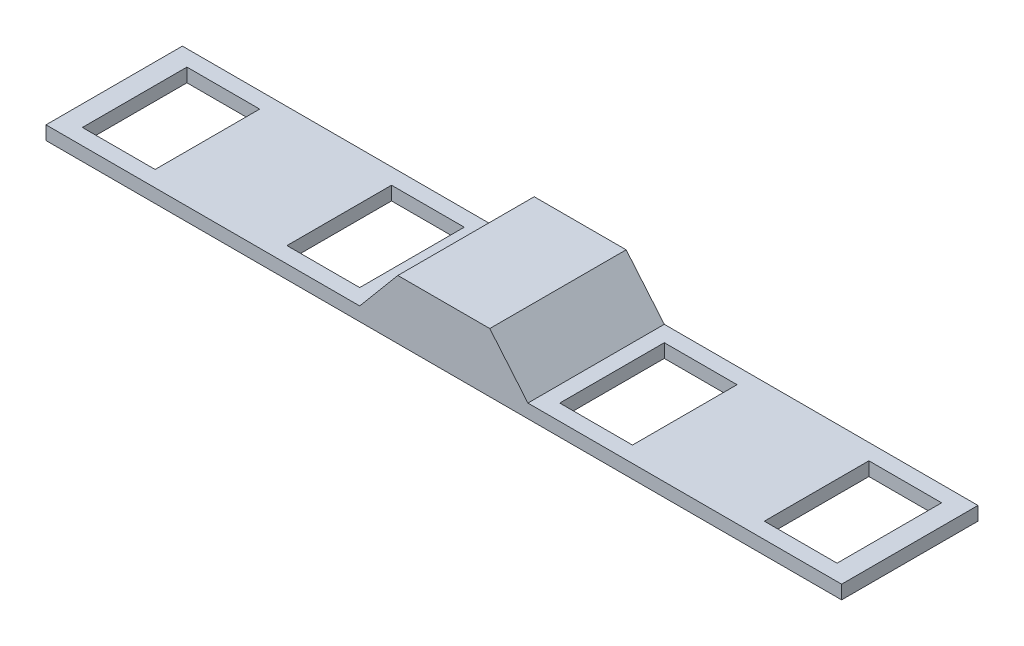
ISO-10303-21;
HEADER;
FILE_DESCRIPTION(('STEP AP214'),'2;1');
FILE_NAME('part.step','',(''),(''),'','','');
FILE_SCHEMA(('AUTOMOTIVE_DESIGN { 1 0 10303 214 1 1 1 1 }'));
ENDSEC;
DATA;
#1=APPLICATION_CONTEXT('core data for automotive mechanical design processes');
#2=APPLICATION_PROTOCOL_DEFINITION('international standard','automotive_design',2000,#1);
#3=PRODUCT_CONTEXT('',#1,'mechanical');
#4=PRODUCT('Part','Part','',(#3));
#5=PRODUCT_RELATED_PRODUCT_CATEGORY('part','',(#4));
#6=PRODUCT_DEFINITION_FORMATION('','',#4);
#7=PRODUCT_DEFINITION_CONTEXT('part definition',#1,'design');
#8=PRODUCT_DEFINITION('design','',#6,#7);
#9=PRODUCT_DEFINITION_SHAPE('','',#8);
#10=(LENGTH_UNIT() NAMED_UNIT(*) SI_UNIT(.MILLI.,.METRE.));
#11=(NAMED_UNIT(*) PLANE_ANGLE_UNIT() SI_UNIT($,.RADIAN.));
#12=(NAMED_UNIT(*) SI_UNIT($,.STERADIAN.) SOLID_ANGLE_UNIT());
#13=UNCERTAINTY_MEASURE_WITH_UNIT(LENGTH_MEASURE(1.E-05),#10,'distance_accuracy_value','');
#14=(GEOMETRIC_REPRESENTATION_CONTEXT(3) GLOBAL_UNCERTAINTY_ASSIGNED_CONTEXT((#13)) GLOBAL_UNIT_ASSIGNED_CONTEXT((#10,
#11,#12)) REPRESENTATION_CONTEXT('',''));
#15=CARTESIAN_POINT('',(0.,0.,0.));
#16=DIRECTION('',(0.,0.,1.));
#17=DIRECTION('',(1.,0.,0.));
#18=AXIS2_PLACEMENT_3D('',#15,#16,#17);
#19=CARTESIAN_POINT('',(0.,3.,0.));
#20=DIRECTION('',(0.,-1.,0.));
#21=DIRECTION('',(0.,0.,-1.));
#22=AXIS2_PLACEMENT_3D('',#19,#20,#21);
#23=PLANE('',#22);
#24=DIRECTION('',(1.,0.,0.));
#25=VECTOR('',#24,1.);
#26=CARTESIAN_POINT('',(83.,3.,11.5));
#27=LINE('',#26,#25);
#28=CARTESIAN_POINT('',(67.,3.,11.5));
#29=VERTEX_POINT('',#28);
#30=CARTESIAN_POINT('',(83.,3.,11.5));
#31=VERTEX_POINT('',#30);
#32=EDGE_CURVE('E228',#29,#31,#27,.T.);
#33=ORIENTED_EDGE('',*,*,#32,.F.);
#34=DIRECTION('',(0.,0.,1.));
#35=VECTOR('',#34,1.);
#36=CARTESIAN_POINT('',(67.,3.,11.5));
#37=LINE('',#36,#35);
#38=CARTESIAN_POINT('',(67.,3.,-11.5));
#39=VERTEX_POINT('',#38);
#40=EDGE_CURVE('E236',#39,#29,#37,.T.);
#41=ORIENTED_EDGE('',*,*,#40,.F.);
#42=DIRECTION('',(-1.,0.,0.));
#43=VECTOR('',#42,1.);
#44=CARTESIAN_POINT('',(83.,3.,-11.5));
#45=LINE('',#44,#43);
#46=CARTESIAN_POINT('',(83.,3.,-11.5));
#47=VERTEX_POINT('',#46);
#48=EDGE_CURVE('E233',#47,#39,#45,.T.);
#49=ORIENTED_EDGE('',*,*,#48,.F.);
#50=DIRECTION('',(0.,0.,-1.));
#51=VECTOR('',#50,1.);
#52=CARTESIAN_POINT('',(83.,3.,11.5));
#53=LINE('',#52,#51);
#54=EDGE_CURVE('E230',#31,#47,#53,.T.);
#55=ORIENTED_EDGE('',*,*,#54,.F.);
#56=EDGE_LOOP('',(#33,#41,#49,#55));
#57=FACE_BOUND('',#56,.T.);
#58=DIRECTION('',(1.,0.,0.));
#59=VECTOR('',#58,1.);
#60=CARTESIAN_POINT('',(38.,3.,11.5));
#61=LINE('',#60,#59);
#62=CARTESIAN_POINT('',(22.,3.,11.5));
#63=VERTEX_POINT('',#62);
#64=CARTESIAN_POINT('',(38.,3.,11.5));
#65=VERTEX_POINT('',#64);
#66=EDGE_CURVE('E260',#63,#65,#61,.T.);
#67=ORIENTED_EDGE('',*,*,#66,.F.);
#68=DIRECTION('',(0.,0.,1.));
#69=VECTOR('',#68,1.);
#70=CARTESIAN_POINT('',(22.,3.,11.5));
#71=LINE('',#70,#69);
#72=CARTESIAN_POINT('',(22.,3.,-11.5));
#73=VERTEX_POINT('',#72);
#74=EDGE_CURVE('E268',#73,#63,#71,.T.);
#75=ORIENTED_EDGE('',*,*,#74,.F.);
#76=DIRECTION('',(-1.,0.,0.));
#77=VECTOR('',#76,1.);
#78=CARTESIAN_POINT('',(38.,3.,-11.5));
#79=LINE('',#78,#77);
#80=CARTESIAN_POINT('',(38.,3.,-11.5));
#81=VERTEX_POINT('',#80);
#82=EDGE_CURVE('E265',#81,#73,#79,.T.);
#83=ORIENTED_EDGE('',*,*,#82,.F.);
#84=DIRECTION('',(0.,0.,-1.));
#85=VECTOR('',#84,1.);
#86=CARTESIAN_POINT('',(38.,3.,11.5));
#87=LINE('',#86,#85);
#88=EDGE_CURVE('E262',#65,#81,#87,.T.);
#89=ORIENTED_EDGE('',*,*,#88,.F.);
#90=EDGE_LOOP('',(#67,#75,#83,#89));
#91=FACE_BOUND('',#90,.T.);
#92=DIRECTION('',(0.,0.,-1.));
#93=VECTOR('',#92,1.);
#94=CARTESIAN_POINT('',(18.5,3.,15.));
#95=LINE('',#94,#93);
#96=CARTESIAN_POINT('',(18.5,3.,15.));
#97=VERTEX_POINT('',#96);
#98=CARTESIAN_POINT('',(18.5,3.,-15.));
#99=VERTEX_POINT('',#98);
#100=EDGE_CURVE('E220',#97,#99,#95,.T.);
#101=ORIENTED_EDGE('',*,*,#100,.F.);
#102=DIRECTION('',(1.,0.,0.));
#103=VECTOR('',#102,1.);
#104=CARTESIAN_POINT('',(-87.5,3.,15.));
#105=LINE('',#104,#103);
#106=CARTESIAN_POINT('',(87.5,3.,15.));
#107=VERTEX_POINT('',#106);
#108=EDGE_CURVE('E215',#97,#107,#105,.T.);
#109=ORIENTED_EDGE('',*,*,#108,.T.);
#110=DIRECTION('',(0.,0.,-1.));
#111=VECTOR('',#110,1.);
#112=CARTESIAN_POINT('',(87.5,3.,15.));
#113=LINE('',#112,#111);
#114=CARTESIAN_POINT('',(87.5,3.,-15.));
#115=VERTEX_POINT('',#114);
#116=EDGE_CURVE('E353',#107,#115,#113,.T.);
#117=ORIENTED_EDGE('',*,*,#116,.T.);
#118=DIRECTION('',(-1.,0.,0.));
#119=VECTOR('',#118,1.);
#120=CARTESIAN_POINT('',(-87.5,3.,-15.));
#121=LINE('',#120,#119);
#122=EDGE_CURVE('E358',#115,#99,#121,.T.);
#123=ORIENTED_EDGE('',*,*,#122,.T.);
#124=EDGE_LOOP('',(#101,#109,#117,#123));
#125=FACE_BOUND('',#124,.T.);
#126=ADVANCED_FACE('F41',(#57,#91,#125),#23,.F.);
#127=DIRECTION('',(0.,0.,-1.));
#128=VECTOR('',#127,1.);
#129=CARTESIAN_POINT('',(-67.,3.,11.5000000000003));
#130=LINE('',#129,#128);
#131=CARTESIAN_POINT('',(-67.,3.,11.5000000000003));
#132=VERTEX_POINT('',#131);
#133=CARTESIAN_POINT('',(-67.,3.,-11.4999999999997));
#134=VERTEX_POINT('',#133);
#135=EDGE_CURVE('E291',#132,#134,#130,.T.);
#136=ORIENTED_EDGE('',*,*,#135,.F.);
#137=DIRECTION('',(1.,0.,0.));
#138=VECTOR('',#137,1.);
#139=CARTESIAN_POINT('',(-83.,3.,11.5000000000003));
#140=LINE('',#139,#138);
#141=CARTESIAN_POINT('',(-83.,3.,11.5000000000003));
#142=VERTEX_POINT('',#141);
#143=EDGE_CURVE('E299',#142,#132,#140,.T.);
#144=ORIENTED_EDGE('',*,*,#143,.F.);
#145=DIRECTION('',(0.,0.,1.));
#146=VECTOR('',#145,1.);
#147=CARTESIAN_POINT('',(-83.,3.,11.5000000000003));
#148=LINE('',#147,#146);
#149=CARTESIAN_POINT('',(-83.,3.,-11.4999999999997));
#150=VERTEX_POINT('',#149);
#151=EDGE_CURVE('E296',#150,#142,#148,.T.);
#152=ORIENTED_EDGE('',*,*,#151,.F.);
#153=DIRECTION('',(-1.,0.,0.));
#154=VECTOR('',#153,1.);
#155=CARTESIAN_POINT('',(-83.,3.,-11.4999999999997));
#156=LINE('',#155,#154);
#157=EDGE_CURVE('E293',#134,#150,#156,.T.);
#158=ORIENTED_EDGE('',*,*,#157,.F.);
#159=EDGE_LOOP('',(#136,#144,#152,#158));
#160=FACE_BOUND('',#159,.T.);
#161=DIRECTION('',(0.,0.,-1.));
#162=VECTOR('',#161,1.);
#163=CARTESIAN_POINT('',(-22.,3.,11.5));
#164=LINE('',#163,#162);
#165=CARTESIAN_POINT('',(-22.,3.,11.5));
#166=VERTEX_POINT('',#165);
#167=CARTESIAN_POINT('',(-22.,3.,-11.5));
#168=VERTEX_POINT('',#167);
#169=EDGE_CURVE('E322',#166,#168,#164,.T.);
#170=ORIENTED_EDGE('',*,*,#169,.F.);
#171=DIRECTION('',(1.,0.,0.));
#172=VECTOR('',#171,1.);
#173=CARTESIAN_POINT('',(-38.,3.,11.5));
#174=LINE('',#173,#172);
#175=CARTESIAN_POINT('',(-38.,3.,11.5));
#176=VERTEX_POINT('',#175);
#177=EDGE_CURVE('E330',#176,#166,#174,.T.);
#178=ORIENTED_EDGE('',*,*,#177,.F.);
#179=DIRECTION('',(0.,0.,1.));
#180=VECTOR('',#179,1.);
#181=CARTESIAN_POINT('',(-38.,3.,11.5));
#182=LINE('',#181,#180);
#183=CARTESIAN_POINT('',(-38.,3.,-11.5));
#184=VERTEX_POINT('',#183);
#185=EDGE_CURVE('E327',#184,#176,#182,.T.);
#186=ORIENTED_EDGE('',*,*,#185,.F.);
#187=DIRECTION('',(-1.,0.,0.));
#188=VECTOR('',#187,1.);
#189=CARTESIAN_POINT('',(-38.,3.,-11.5));
#190=LINE('',#189,#188);
#191=EDGE_CURVE('E324',#168,#184,#190,.T.);
#192=ORIENTED_EDGE('',*,*,#191,.F.);
#193=EDGE_LOOP('',(#170,#178,#186,#192));
#194=FACE_BOUND('',#193,.T.);
#195=DIRECTION('',(0.,0.,1.));
#196=VECTOR('',#195,1.);
#197=CARTESIAN_POINT('',(-18.5,3.,15.));
#198=LINE('',#197,#196);
#199=CARTESIAN_POINT('',(-18.5,3.,-15.));
#200=VERTEX_POINT('',#199);
#201=CARTESIAN_POINT('',(-18.5,3.,15.));
#202=VERTEX_POINT('',#201);
#203=EDGE_CURVE('E209',#200,#202,#198,.T.);
#204=ORIENTED_EDGE('',*,*,#203,.F.);
#205=CARTESIAN_POINT('',(-87.5,3.,-15.));
#206=VERTEX_POINT('',#205);
#207=EDGE_CURVE('E356',#200,#206,#121,.T.);
#208=ORIENTED_EDGE('',*,*,#207,.T.);
#209=DIRECTION('',(0.,0.,1.));
#210=VECTOR('',#209,1.);
#211=CARTESIAN_POINT('',(-87.5,3.,15.));
#212=LINE('',#211,#210);
#213=CARTESIAN_POINT('',(-87.5,3.,15.));
#214=VERTEX_POINT('',#213);
#215=EDGE_CURVE('E212',#206,#214,#212,.T.);
#216=ORIENTED_EDGE('',*,*,#215,.T.);
#217=EDGE_CURVE('E204',#214,#202,#105,.T.);
#218=ORIENTED_EDGE('',*,*,#217,.T.);
#219=EDGE_LOOP('',(#204,#208,#216,#218));
#220=FACE_BOUND('',#219,.T.);
#221=ADVANCED_FACE('F208',(#160,#194,#220),#23,.F.);
#222=CARTESIAN_POINT('',(0.,0.,0.));
#223=DIRECTION('',(0.,-1.,0.));
#224=DIRECTION('',(0.,0.,-1.));
#225=AXIS2_PLACEMENT_3D('',#222,#223,#224);
#226=PLANE('',#225);
#227=DIRECTION('',(0.,0.,-1.));
#228=VECTOR('',#227,1.);
#229=CARTESIAN_POINT('',(87.5,0.,15.));
#230=LINE('',#229,#228);
#231=CARTESIAN_POINT('',(87.5,0.,15.));
#232=VERTEX_POINT('',#231);
#233=CARTESIAN_POINT('',(87.5,0.,-15.));
#234=VERTEX_POINT('',#233);
#235=EDGE_CURVE('E352',#232,#234,#230,.T.);
#236=ORIENTED_EDGE('',*,*,#235,.F.);
#237=DIRECTION('',(1.,0.,0.));
#238=VECTOR('',#237,1.);
#239=CARTESIAN_POINT('',(-87.5,0.,15.));
#240=LINE('',#239,#238);
#241=CARTESIAN_POINT('',(-87.5,0.,15.));
#242=VERTEX_POINT('',#241);
#243=EDGE_CURVE('E357',#242,#232,#240,.T.);
#244=ORIENTED_EDGE('',*,*,#243,.F.);
#245=DIRECTION('',(0.,0.,1.));
#246=VECTOR('',#245,1.);
#247=CARTESIAN_POINT('',(-87.5,0.,15.));
#248=LINE('',#247,#246);
#249=CARTESIAN_POINT('',(-87.5,0.,-15.));
#250=VERTEX_POINT('',#249);
#251=EDGE_CURVE('E366',#250,#242,#248,.T.);
#252=ORIENTED_EDGE('',*,*,#251,.F.);
#253=DIRECTION('',(-1.,0.,0.));
#254=VECTOR('',#253,1.);
#255=CARTESIAN_POINT('',(-87.5,0.,-15.));
#256=LINE('',#255,#254);
#257=EDGE_CURVE('E364',#234,#250,#256,.T.);
#258=ORIENTED_EDGE('',*,*,#257,.F.);
#259=EDGE_LOOP('',(#236,#244,#252,#258));
#260=FACE_BOUND('',#259,.T.);
#261=DIRECTION('',(1.,0.,0.));
#262=VECTOR('',#261,1.);
#263=CARTESIAN_POINT('',(-38.,0.,11.5));
#264=LINE('',#263,#262);
#265=CARTESIAN_POINT('',(-38.,0.,11.5));
#266=VERTEX_POINT('',#265);
#267=CARTESIAN_POINT('',(-22.,0.,11.5));
#268=VERTEX_POINT('',#267);
#269=EDGE_CURVE('E325',#266,#268,#264,.T.);
#270=ORIENTED_EDGE('',*,*,#269,.T.);
#271=DIRECTION('',(0.,0.,-1.));
#272=VECTOR('',#271,1.);
#273=CARTESIAN_POINT('',(-22.,0.,11.5));
#274=LINE('',#273,#272);
#275=CARTESIAN_POINT('',(-22.,0.,-11.5));
#276=VERTEX_POINT('',#275);
#277=EDGE_CURVE('E321',#268,#276,#274,.T.);
#278=ORIENTED_EDGE('',*,*,#277,.T.);
#279=DIRECTION('',(-1.,0.,0.));
#280=VECTOR('',#279,1.);
#281=CARTESIAN_POINT('',(-38.,0.,-11.5));
#282=LINE('',#281,#280);
#283=CARTESIAN_POINT('',(-38.,0.,-11.5));
#284=VERTEX_POINT('',#283);
#285=EDGE_CURVE('E335',#276,#284,#282,.T.);
#286=ORIENTED_EDGE('',*,*,#285,.T.);
#287=DIRECTION('',(0.,0.,1.));
#288=VECTOR('',#287,1.);
#289=CARTESIAN_POINT('',(-38.,0.,11.5));
#290=LINE('',#289,#288);
#291=EDGE_CURVE('E338',#284,#266,#290,.T.);
#292=ORIENTED_EDGE('',*,*,#291,.T.);
#293=EDGE_LOOP('',(#270,#278,#286,#292));
#294=FACE_BOUND('',#293,.T.);
#295=DIRECTION('',(1.,0.,0.));
#296=VECTOR('',#295,1.);
#297=CARTESIAN_POINT('',(-83.,0.,11.5000000000003));
#298=LINE('',#297,#296);
#299=CARTESIAN_POINT('',(-83.,0.,11.5000000000003));
#300=VERTEX_POINT('',#299);
#301=CARTESIAN_POINT('',(-67.,0.,11.5000000000003));
#302=VERTEX_POINT('',#301);
#303=EDGE_CURVE('E294',#300,#302,#298,.T.);
#304=ORIENTED_EDGE('',*,*,#303,.T.);
#305=DIRECTION('',(0.,0.,-1.));
#306=VECTOR('',#305,1.);
#307=CARTESIAN_POINT('',(-67.,0.,11.5000000000003));
#308=LINE('',#307,#306);
#309=CARTESIAN_POINT('',(-67.,0.,-11.4999999999997));
#310=VERTEX_POINT('',#309);
#311=EDGE_CURVE('E290',#302,#310,#308,.T.);
#312=ORIENTED_EDGE('',*,*,#311,.T.);
#313=DIRECTION('',(-1.,0.,0.));
#314=VECTOR('',#313,1.);
#315=CARTESIAN_POINT('',(-83.,0.,-11.4999999999997));
#316=LINE('',#315,#314);
#317=CARTESIAN_POINT('',(-83.,0.,-11.4999999999997));
#318=VERTEX_POINT('',#317);
#319=EDGE_CURVE('E304',#310,#318,#316,.T.);
#320=ORIENTED_EDGE('',*,*,#319,.T.);
#321=DIRECTION('',(0.,0.,1.));
#322=VECTOR('',#321,1.);
#323=CARTESIAN_POINT('',(-83.,0.,11.5000000000003));
#324=LINE('',#323,#322);
#325=EDGE_CURVE('E307',#318,#300,#324,.T.);
#326=ORIENTED_EDGE('',*,*,#325,.T.);
#327=EDGE_LOOP('',(#304,#312,#320,#326));
#328=FACE_BOUND('',#327,.T.);
#329=DIRECTION('',(0.,0.,1.));
#330=VECTOR('',#329,1.);
#331=CARTESIAN_POINT('',(22.,0.,11.5));
#332=LINE('',#331,#330);
#333=CARTESIAN_POINT('',(22.,0.,-11.5));
#334=VERTEX_POINT('',#333);
#335=CARTESIAN_POINT('',(22.,0.,11.5));
#336=VERTEX_POINT('',#335);
#337=EDGE_CURVE('E263',#334,#336,#332,.T.);
#338=ORIENTED_EDGE('',*,*,#337,.T.);
#339=DIRECTION('',(1.,0.,0.));
#340=VECTOR('',#339,1.);
#341=CARTESIAN_POINT('',(38.,0.,11.5));
#342=LINE('',#341,#340);
#343=CARTESIAN_POINT('',(38.,0.,11.5));
#344=VERTEX_POINT('',#343);
#345=EDGE_CURVE('E259',#336,#344,#342,.T.);
#346=ORIENTED_EDGE('',*,*,#345,.T.);
#347=DIRECTION('',(0.,0.,-1.));
#348=VECTOR('',#347,1.);
#349=CARTESIAN_POINT('',(38.,0.,11.5));
#350=LINE('',#349,#348);
#351=CARTESIAN_POINT('',(38.,0.,-11.5));
#352=VERTEX_POINT('',#351);
#353=EDGE_CURVE('E273',#344,#352,#350,.T.);
#354=ORIENTED_EDGE('',*,*,#353,.T.);
#355=DIRECTION('',(-1.,0.,0.));
#356=VECTOR('',#355,1.);
#357=CARTESIAN_POINT('',(38.,0.,-11.5));
#358=LINE('',#357,#356);
#359=EDGE_CURVE('E276',#352,#334,#358,.T.);
#360=ORIENTED_EDGE('',*,*,#359,.T.);
#361=EDGE_LOOP('',(#338,#346,#354,#360));
#362=FACE_BOUND('',#361,.T.);
#363=DIRECTION('',(0.,0.,1.));
#364=VECTOR('',#363,1.);
#365=CARTESIAN_POINT('',(67.,0.,11.5));
#366=LINE('',#365,#364);
#367=CARTESIAN_POINT('',(67.,0.,-11.5));
#368=VERTEX_POINT('',#367);
#369=CARTESIAN_POINT('',(67.,0.,11.5));
#370=VERTEX_POINT('',#369);
#371=EDGE_CURVE('E231',#368,#370,#366,.T.);
#372=ORIENTED_EDGE('',*,*,#371,.T.);
#373=DIRECTION('',(1.,0.,0.));
#374=VECTOR('',#373,1.);
#375=CARTESIAN_POINT('',(83.,0.,11.5));
#376=LINE('',#375,#374);
#377=CARTESIAN_POINT('',(83.,0.,11.5));
#378=VERTEX_POINT('',#377);
#379=EDGE_CURVE('E239',#370,#378,#376,.T.);
#380=ORIENTED_EDGE('',*,*,#379,.T.);
#381=DIRECTION('',(0.,0.,-1.));
#382=VECTOR('',#381,1.);
#383=CARTESIAN_POINT('',(83.,0.,11.5));
#384=LINE('',#383,#382);
#385=CARTESIAN_POINT('',(83.,0.,-11.5));
#386=VERTEX_POINT('',#385);
#387=EDGE_CURVE('E242',#378,#386,#384,.T.);
#388=ORIENTED_EDGE('',*,*,#387,.T.);
#389=DIRECTION('',(-1.,0.,0.));
#390=VECTOR('',#389,1.);
#391=CARTESIAN_POINT('',(83.,0.,-11.5));
#392=LINE('',#391,#390);
#393=EDGE_CURVE('E245',#386,#368,#392,.T.);
#394=ORIENTED_EDGE('',*,*,#393,.T.);
#395=EDGE_LOOP('',(#372,#380,#388,#394));
#396=FACE_BOUND('',#395,.T.);
#397=ADVANCED_FACE('F413',(#260,#294,#328,#362,#396),#226,.T.);
#398=CARTESIAN_POINT('',(87.5,3.,15.));
#399=DIRECTION('',(-1.,0.,0.));
#400=DIRECTION('',(0.,0.,1.));
#401=AXIS2_PLACEMENT_3D('',#398,#399,#400);
#402=PLANE('',#401);
#403=ORIENTED_EDGE('',*,*,#235,.T.);
#404=DIRECTION('',(0.,-1.,0.));
#405=VECTOR('',#404,1.);
#406=CARTESIAN_POINT('',(87.5,3.,-15.));
#407=LINE('',#406,#405);
#408=EDGE_CURVE('E376',#115,#234,#407,.T.);
#409=ORIENTED_EDGE('',*,*,#408,.F.);
#410=ORIENTED_EDGE('',*,*,#116,.F.);
#411=DIRECTION('',(0.,-1.,0.));
#412=VECTOR('',#411,1.);
#413=CARTESIAN_POINT('',(87.5,3.,15.));
#414=LINE('',#413,#412);
#415=EDGE_CURVE('E214',#107,#232,#414,.T.);
#416=ORIENTED_EDGE('',*,*,#415,.T.);
#417=EDGE_LOOP('',(#403,#409,#410,#416));
#418=FACE_BOUND('',#417,.T.);
#419=ADVANCED_FACE('F423',(#418),#402,.F.);
#420=CARTESIAN_POINT('',(-87.5,3.,-15.));
#421=DIRECTION('',(0.,0.,1.));
#422=DIRECTION('',(1.,0.,0.));
#423=AXIS2_PLACEMENT_3D('',#420,#421,#422);
#424=PLANE('',#423);
#425=DIRECTION('',(-1.,0.,0.));
#426=VECTOR('',#425,1.);
#427=CARTESIAN_POINT('',(-18.5,13.,-15.));
#428=LINE('',#427,#426);
#429=CARTESIAN_POINT('',(10.1090036882272,13.,-15.));
#430=VERTEX_POINT('',#429);
#431=CARTESIAN_POINT('',(-10.1090036882272,13.,-15.));
#432=VERTEX_POINT('',#431);
#433=EDGE_CURVE('E219',#430,#432,#428,.T.);
#434=ORIENTED_EDGE('',*,*,#433,.F.);
#435=DIRECTION('',(-0.642787609686538,0.766044443118979,0.));
#436=VECTOR('',#435,1.);
#437=CARTESIAN_POINT('',(10.1090036882272,13.,-15.));
#438=LINE('',#437,#436);
#439=EDGE_CURVE('E206',#430,#99,#438,.F.);
#440=ORIENTED_EDGE('',*,*,#439,.T.);
#441=ORIENTED_EDGE('',*,*,#122,.F.);
#442=ORIENTED_EDGE('',*,*,#408,.T.);
#443=ORIENTED_EDGE('',*,*,#257,.T.);
#444=DIRECTION('',(0.,-1.,0.));
#445=VECTOR('',#444,1.);
#446=CARTESIAN_POINT('',(-87.5,3.,-15.));
#447=LINE('',#446,#445);
#448=EDGE_CURVE('E373',#206,#250,#447,.T.);
#449=ORIENTED_EDGE('',*,*,#448,.F.);
#450=ORIENTED_EDGE('',*,*,#207,.F.);
#451=DIRECTION('',(-0.642787609686538,-0.766044443118979,0.));
#452=VECTOR('',#451,1.);
#453=CARTESIAN_POINT('',(-10.1090036882272,13.,-15.));
#454=LINE('',#453,#452);
#455=EDGE_CURVE('E218',#200,#432,#454,.F.);
#456=ORIENTED_EDGE('',*,*,#455,.T.);
#457=EDGE_LOOP('',(#434,#440,#441,#442,#443,#449,#450,#456));
#458=FACE_BOUND('',#457,.T.);
#459=ADVANCED_FACE('F387',(#458),#424,.F.);
#460=CARTESIAN_POINT('',(-87.5,3.,15.));
#461=DIRECTION('',(1.,0.,0.));
#462=DIRECTION('',(0.,0.,-1.));
#463=AXIS2_PLACEMENT_3D('',#460,#461,#462);
#464=PLANE('',#463);
#465=ORIENTED_EDGE('',*,*,#251,.T.);
#466=DIRECTION('',(0.,-1.,0.));
#467=VECTOR('',#466,1.);
#468=CARTESIAN_POINT('',(-87.5,3.,15.));
#469=LINE('',#468,#467);
#470=EDGE_CURVE('E371',#214,#242,#469,.T.);
#471=ORIENTED_EDGE('',*,*,#470,.F.);
#472=ORIENTED_EDGE('',*,*,#215,.F.);
#473=ORIENTED_EDGE('',*,*,#448,.T.);
#474=EDGE_LOOP('',(#465,#471,#472,#473));
#475=FACE_BOUND('',#474,.T.);
#476=ADVANCED_FACE('F426',(#475),#464,.F.);
#477=CARTESIAN_POINT('',(-87.5,3.,15.));
#478=DIRECTION('',(0.,0.,-1.));
#479=DIRECTION('',(-1.,0.,0.));
#480=AXIS2_PLACEMENT_3D('',#477,#478,#479);
#481=PLANE('',#480);
#482=ORIENTED_EDGE('',*,*,#108,.F.);
#483=DIRECTION('',(0.642787609686538,-0.766044443118979,0.));
#484=VECTOR('',#483,1.);
#485=CARTESIAN_POINT('',(10.1090036882272,13.,15.));
#486=LINE('',#485,#484);
#487=CARTESIAN_POINT('',(10.1090036882272,13.,15.));
#488=VERTEX_POINT('',#487);
#489=EDGE_CURVE('E11',#97,#488,#486,.F.);
#490=ORIENTED_EDGE('',*,*,#489,.T.);
#491=DIRECTION('',(1.,0.,0.));
#492=VECTOR('',#491,1.);
#493=CARTESIAN_POINT('',(-18.5,13.,15.));
#494=LINE('',#493,#492);
#495=CARTESIAN_POINT('',(-10.1090036882272,13.,15.));
#496=VERTEX_POINT('',#495);
#497=EDGE_CURVE('E205',#496,#488,#494,.T.);
#498=ORIENTED_EDGE('',*,*,#497,.F.);
#499=DIRECTION('',(0.642787609686538,0.766044443118979,0.));
#500=VECTOR('',#499,1.);
#501=CARTESIAN_POINT('',(-10.1090036882272,13.,15.));
#502=LINE('',#501,#500);
#503=EDGE_CURVE('E50',#496,#202,#502,.F.);
#504=ORIENTED_EDGE('',*,*,#503,.T.);
#505=ORIENTED_EDGE('',*,*,#217,.F.);
#506=ORIENTED_EDGE('',*,*,#470,.T.);
#507=ORIENTED_EDGE('',*,*,#243,.T.);
#508=ORIENTED_EDGE('',*,*,#415,.F.);
#509=EDGE_LOOP('',(#482,#490,#498,#504,#505,#506,#507,#508));
#510=FACE_BOUND('',#509,.T.);
#511=ADVANCED_FACE('F202',(#510),#481,.F.);
#512=CARTESIAN_POINT('',(-22.,3.,11.5));
#513=DIRECTION('',(-1.,0.,0.));
#514=DIRECTION('',(0.,0.,1.));
#515=AXIS2_PLACEMENT_3D('',#512,#513,#514);
#516=PLANE('',#515);
#517=ORIENTED_EDGE('',*,*,#277,.F.);
#518=DIRECTION('',(0.,-1.,0.));
#519=VECTOR('',#518,1.);
#520=CARTESIAN_POINT('',(-22.,3.,11.5));
#521=LINE('',#520,#519);
#522=EDGE_CURVE('E332',#166,#268,#521,.T.);
#523=ORIENTED_EDGE('',*,*,#522,.F.);
#524=ORIENTED_EDGE('',*,*,#169,.T.);
#525=DIRECTION('',(0.,-1.,0.));
#526=VECTOR('',#525,1.);
#527=CARTESIAN_POINT('',(-22.,3.,-11.5));
#528=LINE('',#527,#526);
#529=EDGE_CURVE('E349',#168,#276,#528,.T.);
#530=ORIENTED_EDGE('',*,*,#529,.T.);
#531=EDGE_LOOP('',(#517,#523,#524,#530));
#532=FACE_BOUND('',#531,.T.);
#533=ADVANCED_FACE('F419',(#532),#516,.T.);
#534=CARTESIAN_POINT('',(-38.,3.,-11.5));
#535=DIRECTION('',(0.,0.,1.));
#536=DIRECTION('',(1.,0.,0.));
#537=AXIS2_PLACEMENT_3D('',#534,#535,#536);
#538=PLANE('',#537);
#539=ORIENTED_EDGE('',*,*,#285,.F.);
#540=ORIENTED_EDGE('',*,*,#529,.F.);
#541=ORIENTED_EDGE('',*,*,#191,.T.);
#542=DIRECTION('',(0.,-1.,0.));
#543=VECTOR('',#542,1.);
#544=CARTESIAN_POINT('',(-38.,3.,-11.5));
#545=LINE('',#544,#543);
#546=EDGE_CURVE('E347',#184,#284,#545,.T.);
#547=ORIENTED_EDGE('',*,*,#546,.T.);
#548=EDGE_LOOP('',(#539,#540,#541,#547));
#549=FACE_BOUND('',#548,.T.);
#550=ADVANCED_FACE('F513',(#549),#538,.T.);
#551=CARTESIAN_POINT('',(-38.,3.,11.5));
#552=DIRECTION('',(1.,0.,0.));
#553=DIRECTION('',(0.,0.,-1.));
#554=AXIS2_PLACEMENT_3D('',#551,#552,#553);
#555=PLANE('',#554);
#556=ORIENTED_EDGE('',*,*,#291,.F.);
#557=ORIENTED_EDGE('',*,*,#546,.F.);
#558=ORIENTED_EDGE('',*,*,#185,.T.);
#559=DIRECTION('',(0.,-1.,0.));
#560=VECTOR('',#559,1.);
#561=CARTESIAN_POINT('',(-38.,3.,11.5));
#562=LINE('',#561,#560);
#563=EDGE_CURVE('E345',#176,#266,#562,.T.);
#564=ORIENTED_EDGE('',*,*,#563,.T.);
#565=EDGE_LOOP('',(#556,#557,#558,#564));
#566=FACE_BOUND('',#565,.T.);
#567=ADVANCED_FACE('F510',(#566),#555,.T.);
#568=CARTESIAN_POINT('',(-38.,3.,11.5));
#569=DIRECTION('',(0.,0.,-1.));
#570=DIRECTION('',(-1.,0.,0.));
#571=AXIS2_PLACEMENT_3D('',#568,#569,#570);
#572=PLANE('',#571);
#573=ORIENTED_EDGE('',*,*,#269,.F.);
#574=ORIENTED_EDGE('',*,*,#563,.F.);
#575=ORIENTED_EDGE('',*,*,#177,.T.);
#576=ORIENTED_EDGE('',*,*,#522,.T.);
#577=EDGE_LOOP('',(#573,#574,#575,#576));
#578=FACE_BOUND('',#577,.T.);
#579=ADVANCED_FACE('F506',(#578),#572,.T.);
#580=CARTESIAN_POINT('',(-67.,3.,11.5000000000003));
#581=DIRECTION('',(-1.,0.,0.));
#582=DIRECTION('',(0.,0.,1.));
#583=AXIS2_PLACEMENT_3D('',#580,#581,#582);
#584=PLANE('',#583);
#585=ORIENTED_EDGE('',*,*,#311,.F.);
#586=DIRECTION('',(0.,-1.,0.));
#587=VECTOR('',#586,1.);
#588=CARTESIAN_POINT('',(-67.,3.,11.5000000000003));
#589=LINE('',#588,#587);
#590=EDGE_CURVE('E301',#132,#302,#589,.T.);
#591=ORIENTED_EDGE('',*,*,#590,.F.);
#592=ORIENTED_EDGE('',*,*,#135,.T.);
#593=DIRECTION('',(0.,-1.,0.));
#594=VECTOR('',#593,1.);
#595=CARTESIAN_POINT('',(-67.,3.,-11.4999999999997));
#596=LINE('',#595,#594);
#597=EDGE_CURVE('E318',#134,#310,#596,.T.);
#598=ORIENTED_EDGE('',*,*,#597,.T.);
#599=EDGE_LOOP('',(#585,#591,#592,#598));
#600=FACE_BOUND('',#599,.T.);
#601=ADVANCED_FACE('F502',(#600),#584,.T.);
#602=CARTESIAN_POINT('',(-83.,3.,-11.4999999999997));
#603=DIRECTION('',(0.,0.,1.));
#604=DIRECTION('',(1.,0.,0.));
#605=AXIS2_PLACEMENT_3D('',#602,#603,#604);
#606=PLANE('',#605);
#607=ORIENTED_EDGE('',*,*,#319,.F.);
#608=ORIENTED_EDGE('',*,*,#597,.F.);
#609=ORIENTED_EDGE('',*,*,#157,.T.);
#610=DIRECTION('',(0.,-1.,0.));
#611=VECTOR('',#610,1.);
#612=CARTESIAN_POINT('',(-83.,3.,-11.4999999999997));
#613=LINE('',#612,#611);
#614=EDGE_CURVE('E316',#150,#318,#613,.T.);
#615=ORIENTED_EDGE('',*,*,#614,.T.);
#616=EDGE_LOOP('',(#607,#608,#609,#615));
#617=FACE_BOUND('',#616,.T.);
#618=ADVANCED_FACE('F498',(#617),#606,.T.);
#619=CARTESIAN_POINT('',(-83.,3.,11.5000000000003));
#620=DIRECTION('',(1.,0.,0.));
#621=DIRECTION('',(0.,0.,-1.));
#622=AXIS2_PLACEMENT_3D('',#619,#620,#621);
#623=PLANE('',#622);
#624=ORIENTED_EDGE('',*,*,#325,.F.);
#625=ORIENTED_EDGE('',*,*,#614,.F.);
#626=ORIENTED_EDGE('',*,*,#151,.T.);
#627=DIRECTION('',(0.,-1.,0.));
#628=VECTOR('',#627,1.);
#629=CARTESIAN_POINT('',(-83.,3.,11.5000000000003));
#630=LINE('',#629,#628);
#631=EDGE_CURVE('E314',#142,#300,#630,.T.);
#632=ORIENTED_EDGE('',*,*,#631,.T.);
#633=EDGE_LOOP('',(#624,#625,#626,#632));
#634=FACE_BOUND('',#633,.T.);
#635=ADVANCED_FACE('F494',(#634),#623,.T.);
#636=CARTESIAN_POINT('',(-83.,3.,11.5000000000003));
#637=DIRECTION('',(0.,0.,-1.));
#638=DIRECTION('',(-1.,0.,0.));
#639=AXIS2_PLACEMENT_3D('',#636,#637,#638);
#640=PLANE('',#639);
#641=ORIENTED_EDGE('',*,*,#303,.F.);
#642=ORIENTED_EDGE('',*,*,#631,.F.);
#643=ORIENTED_EDGE('',*,*,#143,.T.);
#644=ORIENTED_EDGE('',*,*,#590,.T.);
#645=EDGE_LOOP('',(#641,#642,#643,#644));
#646=FACE_BOUND('',#645,.T.);
#647=ADVANCED_FACE('F490',(#646),#640,.T.);
#648=CARTESIAN_POINT('',(38.,3.,11.5));
#649=DIRECTION('',(0.,0.,-1.));
#650=DIRECTION('',(-1.,0.,0.));
#651=AXIS2_PLACEMENT_3D('',#648,#649,#650);
#652=PLANE('',#651);
#653=ORIENTED_EDGE('',*,*,#345,.F.);
#654=DIRECTION('',(0.,-1.,0.));
#655=VECTOR('',#654,1.);
#656=CARTESIAN_POINT('',(22.,3.,11.5));
#657=LINE('',#656,#655);
#658=EDGE_CURVE('E270',#63,#336,#657,.T.);
#659=ORIENTED_EDGE('',*,*,#658,.F.);
#660=ORIENTED_EDGE('',*,*,#66,.T.);
#661=DIRECTION('',(0.,-1.,0.));
#662=VECTOR('',#661,1.);
#663=CARTESIAN_POINT('',(38.,3.,11.5));
#664=LINE('',#663,#662);
#665=EDGE_CURVE('E287',#65,#344,#664,.T.);
#666=ORIENTED_EDGE('',*,*,#665,.T.);
#667=EDGE_LOOP('',(#653,#659,#660,#666));
#668=FACE_BOUND('',#667,.T.);
#669=ADVANCED_FACE('F486',(#668),#652,.T.);
#670=CARTESIAN_POINT('',(38.,3.,11.5));
#671=DIRECTION('',(-1.,0.,0.));
#672=DIRECTION('',(0.,0.,1.));
#673=AXIS2_PLACEMENT_3D('',#670,#671,#672);
#674=PLANE('',#673);
#675=ORIENTED_EDGE('',*,*,#353,.F.);
#676=ORIENTED_EDGE('',*,*,#665,.F.);
#677=ORIENTED_EDGE('',*,*,#88,.T.);
#678=DIRECTION('',(0.,-1.,0.));
#679=VECTOR('',#678,1.);
#680=CARTESIAN_POINT('',(38.,3.,-11.5));
#681=LINE('',#680,#679);
#682=EDGE_CURVE('E285',#81,#352,#681,.T.);
#683=ORIENTED_EDGE('',*,*,#682,.T.);
#684=EDGE_LOOP('',(#675,#676,#677,#683));
#685=FACE_BOUND('',#684,.T.);
#686=ADVANCED_FACE('F482',(#685),#674,.T.);
#687=CARTESIAN_POINT('',(38.,3.,-11.5));
#688=DIRECTION('',(0.,0.,1.));
#689=DIRECTION('',(1.,0.,0.));
#690=AXIS2_PLACEMENT_3D('',#687,#688,#689);
#691=PLANE('',#690);
#692=ORIENTED_EDGE('',*,*,#359,.F.);
#693=ORIENTED_EDGE('',*,*,#682,.F.);
#694=ORIENTED_EDGE('',*,*,#82,.T.);
#695=DIRECTION('',(0.,-1.,0.));
#696=VECTOR('',#695,1.);
#697=CARTESIAN_POINT('',(22.,3.,-11.5));
#698=LINE('',#697,#696);
#699=EDGE_CURVE('E283',#73,#334,#698,.T.);
#700=ORIENTED_EDGE('',*,*,#699,.T.);
#701=EDGE_LOOP('',(#692,#693,#694,#700));
#702=FACE_BOUND('',#701,.T.);
#703=ADVANCED_FACE('F478',(#702),#691,.T.);
#704=CARTESIAN_POINT('',(22.,3.,11.5));
#705=DIRECTION('',(1.,0.,0.));
#706=DIRECTION('',(0.,0.,-1.));
#707=AXIS2_PLACEMENT_3D('',#704,#705,#706);
#708=PLANE('',#707);
#709=ORIENTED_EDGE('',*,*,#337,.F.);
#710=ORIENTED_EDGE('',*,*,#699,.F.);
#711=ORIENTED_EDGE('',*,*,#74,.T.);
#712=ORIENTED_EDGE('',*,*,#658,.T.);
#713=EDGE_LOOP('',(#709,#710,#711,#712));
#714=FACE_BOUND('',#713,.T.);
#715=ADVANCED_FACE('F475',(#714),#708,.T.);
#716=CARTESIAN_POINT('',(83.,3.,11.5));
#717=DIRECTION('',(0.,0.,-1.));
#718=DIRECTION('',(-1.,0.,0.));
#719=AXIS2_PLACEMENT_3D('',#716,#717,#718);
#720=PLANE('',#719);
#721=ORIENTED_EDGE('',*,*,#379,.F.);
#722=DIRECTION('',(0.,-1.,0.));
#723=VECTOR('',#722,1.);
#724=CARTESIAN_POINT('',(67.,3.,11.5));
#725=LINE('',#724,#723);
#726=EDGE_CURVE('E238',#29,#370,#725,.T.);
#727=ORIENTED_EDGE('',*,*,#726,.F.);
#728=ORIENTED_EDGE('',*,*,#32,.T.);
#729=DIRECTION('',(0.,-1.,0.));
#730=VECTOR('',#729,1.);
#731=CARTESIAN_POINT('',(83.,3.,11.5));
#732=LINE('',#731,#730);
#733=EDGE_CURVE('E256',#31,#378,#732,.T.);
#734=ORIENTED_EDGE('',*,*,#733,.T.);
#735=EDGE_LOOP('',(#721,#727,#728,#734));
#736=FACE_BOUND('',#735,.T.);
#737=ADVANCED_FACE('F458',(#736),#720,.T.);
#738=CARTESIAN_POINT('',(83.,3.,11.5));
#739=DIRECTION('',(-1.,0.,0.));
#740=DIRECTION('',(0.,0.,1.));
#741=AXIS2_PLACEMENT_3D('',#738,#739,#740);
#742=PLANE('',#741);
#743=ORIENTED_EDGE('',*,*,#387,.F.);
#744=ORIENTED_EDGE('',*,*,#733,.F.);
#745=ORIENTED_EDGE('',*,*,#54,.T.);
#746=DIRECTION('',(0.,-1.,0.));
#747=VECTOR('',#746,1.);
#748=CARTESIAN_POINT('',(83.,3.,-11.5));
#749=LINE('',#748,#747);
#750=EDGE_CURVE('E254',#47,#386,#749,.T.);
#751=ORIENTED_EDGE('',*,*,#750,.T.);
#752=EDGE_LOOP('',(#743,#744,#745,#751));
#753=FACE_BOUND('',#752,.T.);
#754=ADVANCED_FACE('F464',(#753),#742,.T.);
#755=CARTESIAN_POINT('',(83.,3.,-11.5));
#756=DIRECTION('',(0.,0.,1.));
#757=DIRECTION('',(1.,0.,0.));
#758=AXIS2_PLACEMENT_3D('',#755,#756,#757);
#759=PLANE('',#758);
#760=ORIENTED_EDGE('',*,*,#393,.F.);
#761=ORIENTED_EDGE('',*,*,#750,.F.);
#762=ORIENTED_EDGE('',*,*,#48,.T.);
#763=DIRECTION('',(0.,-1.,0.));
#764=VECTOR('',#763,1.);
#765=CARTESIAN_POINT('',(67.,3.,-11.5));
#766=LINE('',#765,#764);
#767=EDGE_CURVE('E252',#39,#368,#766,.T.);
#768=ORIENTED_EDGE('',*,*,#767,.T.);
#769=EDGE_LOOP('',(#760,#761,#762,#768));
#770=FACE_BOUND('',#769,.T.);
#771=ADVANCED_FACE('F404',(#770),#759,.T.);
#772=CARTESIAN_POINT('',(67.,3.,11.5));
#773=DIRECTION('',(1.,0.,0.));
#774=DIRECTION('',(0.,0.,-1.));
#775=AXIS2_PLACEMENT_3D('',#772,#773,#774);
#776=PLANE('',#775);
#777=ORIENTED_EDGE('',*,*,#371,.F.);
#778=ORIENTED_EDGE('',*,*,#767,.F.);
#779=ORIENTED_EDGE('',*,*,#40,.T.);
#780=ORIENTED_EDGE('',*,*,#726,.T.);
#781=EDGE_LOOP('',(#777,#778,#779,#780));
#782=FACE_BOUND('',#781,.T.);
#783=ADVANCED_FACE('F397',(#782),#776,.T.);
#784=CARTESIAN_POINT('',(0.,13.,0.));
#785=DIRECTION('',(0.,-1.,0.));
#786=DIRECTION('',(0.,0.,-1.));
#787=AXIS2_PLACEMENT_3D('',#784,#785,#786);
#788=PLANE('',#787);
#789=ORIENTED_EDGE('',*,*,#497,.T.);
#790=DIRECTION('',(0.,0.,-1.));
#791=VECTOR('',#790,1.);
#792=CARTESIAN_POINT('',(10.1090036882272,13.,0.));
#793=LINE('',#792,#791);
#794=EDGE_CURVE('E381',#488,#430,#793,.T.);
#795=ORIENTED_EDGE('',*,*,#794,.T.);
#796=ORIENTED_EDGE('',*,*,#433,.T.);
#797=DIRECTION('',(0.,0.,1.));
#798=VECTOR('',#797,1.);
#799=CARTESIAN_POINT('',(-10.1090036882272,13.,0.));
#800=LINE('',#799,#798);
#801=EDGE_CURVE('E379',#432,#496,#800,.T.);
#802=ORIENTED_EDGE('',*,*,#801,.T.);
#803=EDGE_LOOP('',(#789,#795,#796,#802));
#804=FACE_BOUND('',#803,.T.);
#805=ADVANCED_FACE('F395',(#804),#788,.F.);
#806=CARTESIAN_POINT('',(10.1090036882272,13.,0.));
#807=DIRECTION('',(-0.766044443118979,-0.642787609686538,0.));
#808=DIRECTION('',(0.,0.,-1.));
#809=AXIS2_PLACEMENT_3D('',#806,#807,#808);
#810=PLANE('',#809);
#811=ORIENTED_EDGE('',*,*,#489,.F.);
#812=ORIENTED_EDGE('',*,*,#100,.T.);
#813=ORIENTED_EDGE('',*,*,#439,.F.);
#814=ORIENTED_EDGE('',*,*,#794,.F.);
#815=EDGE_LOOP('',(#811,#812,#813,#814));
#816=FACE_BOUND('',#815,.T.);
#817=ADVANCED_FACE('F393',(#816),#810,.F.);
#818=CARTESIAN_POINT('',(-10.1090036882272,13.,0.));
#819=DIRECTION('',(0.766044443118979,-0.642787609686538,0.));
#820=DIRECTION('',(0.,0.,1.));
#821=AXIS2_PLACEMENT_3D('',#818,#819,#820);
#822=PLANE('',#821);
#823=ORIENTED_EDGE('',*,*,#455,.F.);
#824=ORIENTED_EDGE('',*,*,#203,.T.);
#825=ORIENTED_EDGE('',*,*,#503,.F.);
#826=ORIENTED_EDGE('',*,*,#801,.F.);
#827=EDGE_LOOP('',(#823,#824,#825,#826));
#828=FACE_BOUND('',#827,.T.);
#829=ADVANCED_FACE('F44',(#828),#822,.F.);
#830=CLOSED_SHELL('',(#126,#221,#397,#419,#459,#476,#511,#533,#550,#567,#579,#601,#618,#635,
#647,#669,#686,#703,#715,#737,#754,#771,#783,#805,#817,#829));
#831=MANIFOLD_SOLID_BREP('B2',#830);
#832=ADVANCED_BREP_SHAPE_REPRESENTATION('',(#18,#831),#14);
#833=SHAPE_DEFINITION_REPRESENTATION(#9,#832);
ENDSEC;
END-ISO-10303-21;
